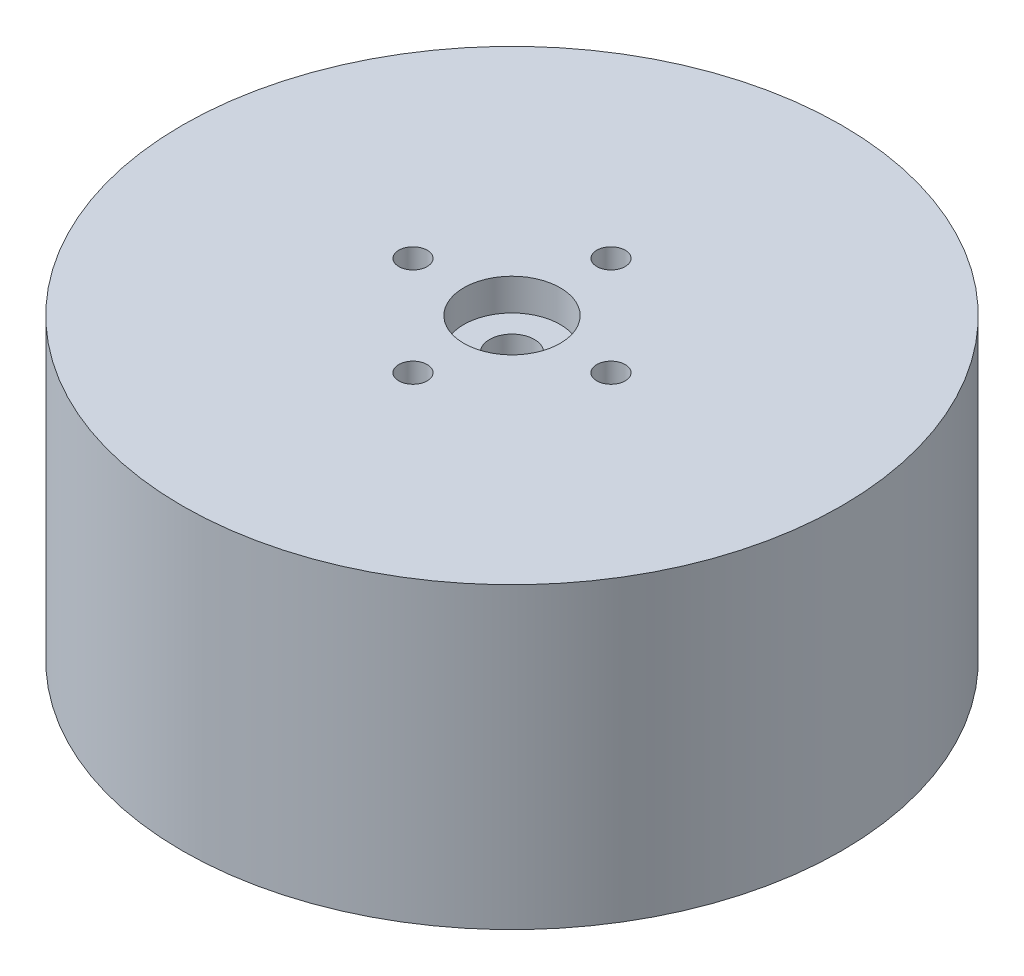
ISO-10303-21;
HEADER;
FILE_DESCRIPTION(('STEP AP214'),'2;1');
FILE_NAME('part.step','',(''),(''),'','','');
FILE_SCHEMA(('AUTOMOTIVE_DESIGN { 1 0 10303 214 1 1 1 1 }'));
ENDSEC;
DATA;
#1=APPLICATION_CONTEXT('core data for automotive mechanical design processes');
#2=APPLICATION_PROTOCOL_DEFINITION('international standard','automotive_design',2000,#1);
#3=PRODUCT_CONTEXT('',#1,'mechanical');
#4=PRODUCT('Part','Part','',(#3));
#5=PRODUCT_RELATED_PRODUCT_CATEGORY('part','',(#4));
#6=PRODUCT_DEFINITION_FORMATION('','',#4);
#7=PRODUCT_DEFINITION_CONTEXT('part definition',#1,'design');
#8=PRODUCT_DEFINITION('design','',#6,#7);
#9=PRODUCT_DEFINITION_SHAPE('','',#8);
#10=(LENGTH_UNIT() NAMED_UNIT(*) SI_UNIT(.MILLI.,.METRE.));
#11=(NAMED_UNIT(*) PLANE_ANGLE_UNIT() SI_UNIT($,.RADIAN.));
#12=(NAMED_UNIT(*) SI_UNIT($,.STERADIAN.) SOLID_ANGLE_UNIT());
#13=UNCERTAINTY_MEASURE_WITH_UNIT(LENGTH_MEASURE(1.E-05),#10,'distance_accuracy_value','');
#14=(GEOMETRIC_REPRESENTATION_CONTEXT(3) GLOBAL_UNCERTAINTY_ASSIGNED_CONTEXT((#13)) GLOBAL_UNIT_ASSIGNED_CONTEXT((#10,
#11,#12)) REPRESENTATION_CONTEXT('',''));
#15=CARTESIAN_POINT('',(0.,0.,0.));
#16=DIRECTION('',(0.,0.,1.));
#17=DIRECTION('',(1.,0.,0.));
#18=AXIS2_PLACEMENT_3D('',#15,#16,#17);
#19=CARTESIAN_POINT('',(0.,34.7,0.));
#20=DIRECTION('',(0.,-1.,0.));
#21=DIRECTION('',(0.,0.,-1.));
#22=AXIS2_PLACEMENT_3D('',#19,#20,#21);
#23=CYLINDRICAL_SURFACE('',#22,2.6);
#24=CARTESIAN_POINT('',(0.,3.7,0.));
#25=DIRECTION('',(0.,-1.,0.));
#26=DIRECTION('',(0.,0.,-1.));
#27=AXIS2_PLACEMENT_3D('',#24,#25,#26);
#28=CIRCLE('',#27,2.6);
#29=CARTESIAN_POINT('',(0.,3.7,-2.6));
#30=VERTEX_POINT('',#29);
#31=EDGE_CURVE('E44',#30,#30,#28,.F.);
#32=ORIENTED_EDGE('',*,*,#31,.F.);
#33=EDGE_LOOP('',(#32));
#34=FACE_BOUND('',#33,.T.);
#35=CARTESIAN_POINT('',(0.,31.,0.));
#36=DIRECTION('',(0.,1.,0.));
#37=DIRECTION('',(0.,0.,1.));
#38=AXIS2_PLACEMENT_3D('',#35,#36,#37);
#39=CIRCLE('',#38,2.6);
#40=CARTESIAN_POINT('',(0.,31.,2.6));
#41=VERTEX_POINT('',#40);
#42=EDGE_CURVE('E35',#41,#41,#39,.F.);
#43=ORIENTED_EDGE('',*,*,#42,.F.);
#44=EDGE_LOOP('',(#43));
#45=FACE_BOUND('',#44,.T.);
#46=ADVANCED_FACE('F31',(#34,#45),#23,.F.);
#47=CARTESIAN_POINT('',(0.,34.7,0.));
#48=DIRECTION('',(0.,-1.,0.));
#49=DIRECTION('',(0.,0.,-1.));
#50=AXIS2_PLACEMENT_3D('',#47,#48,#49);
#51=CYLINDRICAL_SURFACE('',#50,38.3);
#52=CARTESIAN_POINT('',(0.,34.7,0.));
#53=DIRECTION('',(0.,1.,0.));
#54=DIRECTION('',(0.,0.,1.));
#55=AXIS2_PLACEMENT_3D('',#52,#53,#54);
#56=CIRCLE('',#55,38.3);
#57=CARTESIAN_POINT('',(0.,34.7,38.3));
#58=VERTEX_POINT('',#57);
#59=EDGE_CURVE('E10',#58,#58,#56,.T.);
#60=ORIENTED_EDGE('',*,*,#59,.F.);
#61=EDGE_LOOP('',(#60));
#62=FACE_BOUND('',#61,.T.);
#63=CARTESIAN_POINT('',(0.,0.,0.));
#64=DIRECTION('',(0.,1.,0.));
#65=DIRECTION('',(0.,0.,1.));
#66=AXIS2_PLACEMENT_3D('',#63,#64,#65);
#67=CIRCLE('',#66,38.3);
#68=CARTESIAN_POINT('',(0.,0.,38.3));
#69=VERTEX_POINT('',#68);
#70=EDGE_CURVE('E39',#69,#69,#67,.T.);
#71=ORIENTED_EDGE('',*,*,#70,.T.);
#72=EDGE_LOOP('',(#71));
#73=FACE_BOUND('',#72,.T.);
#74=ADVANCED_FACE('F33',(#62,#73),#51,.T.);
#75=CARTESIAN_POINT('',(0.,34.7,0.));
#76=DIRECTION('',(0.,1.,0.));
#77=DIRECTION('',(0.,0.,1.));
#78=AXIS2_PLACEMENT_3D('',#75,#76,#77);
#79=PLANE('',#78);
#80=CARTESIAN_POINT('',(0.,34.7,-11.5));
#81=DIRECTION('',(0.,1.,0.));
#82=DIRECTION('',(0.,0.,1.));
#83=AXIS2_PLACEMENT_3D('',#80,#81,#82);
#84=CIRCLE('',#83,1.65);
#85=CARTESIAN_POINT('',(0.,34.7,-9.85));
#86=VERTEX_POINT('',#85);
#87=EDGE_CURVE('E83',#86,#86,#84,.T.);
#88=ORIENTED_EDGE('',*,*,#87,.F.);
#89=EDGE_LOOP('',(#88));
#90=FACE_BOUND('',#89,.T.);
#91=CARTESIAN_POINT('',(11.5,34.7,0.));
#92=DIRECTION('',(0.,1.,0.));
#93=DIRECTION('',(0.,0.,1.));
#94=AXIS2_PLACEMENT_3D('',#91,#92,#93);
#95=CIRCLE('',#94,1.65);
#96=CARTESIAN_POINT('',(11.5,34.7,1.65000000000004));
#97=VERTEX_POINT('',#96);
#98=EDGE_CURVE('E77',#97,#97,#95,.T.);
#99=ORIENTED_EDGE('',*,*,#98,.F.);
#100=EDGE_LOOP('',(#99));
#101=FACE_BOUND('',#100,.T.);
#102=CARTESIAN_POINT('',(0.,34.7,11.5));
#103=DIRECTION('',(0.,1.,0.));
#104=DIRECTION('',(0.,0.,1.));
#105=AXIS2_PLACEMENT_3D('',#102,#103,#104);
#106=CIRCLE('',#105,1.65);
#107=CARTESIAN_POINT('',(0.,34.7,13.15));
#108=VERTEX_POINT('',#107);
#109=EDGE_CURVE('E71',#108,#108,#106,.T.);
#110=ORIENTED_EDGE('',*,*,#109,.F.);
#111=EDGE_LOOP('',(#110));
#112=FACE_BOUND('',#111,.T.);
#113=CARTESIAN_POINT('',(-11.5,34.7,-1.20456106190088E-13));
#114=DIRECTION('',(0.,1.,0.));
#115=DIRECTION('',(0.,0.,1.));
#116=AXIS2_PLACEMENT_3D('',#113,#114,#115);
#117=CIRCLE('',#116,1.65);
#118=CARTESIAN_POINT('',(-11.5,34.7,1.64999999999988));
#119=VERTEX_POINT('',#118);
#120=EDGE_CURVE('E65',#119,#119,#117,.T.);
#121=ORIENTED_EDGE('',*,*,#120,.F.);
#122=EDGE_LOOP('',(#121));
#123=FACE_BOUND('',#122,.T.);
#124=CARTESIAN_POINT('',(0.,34.7,0.));
#125=DIRECTION('',(0.,1.,0.));
#126=DIRECTION('',(0.,0.,1.));
#127=AXIS2_PLACEMENT_3D('',#124,#125,#126);
#128=CIRCLE('',#127,5.6);
#129=CARTESIAN_POINT('',(0.,34.7,5.6));
#130=VERTEX_POINT('',#129);
#131=EDGE_CURVE('E58',#130,#130,#128,.T.);
#132=ORIENTED_EDGE('',*,*,#131,.F.);
#133=EDGE_LOOP('',(#132));
#134=FACE_BOUND('',#133,.T.);
#135=ORIENTED_EDGE('',*,*,#59,.T.);
#136=EDGE_LOOP('',(#135));
#137=FACE_BOUND('',#136,.T.);
#138=ADVANCED_FACE('F99',(#90,#101,#112,#123,#134,#137),#79,.T.);
#139=CARTESIAN_POINT('',(0.,0.,0.));
#140=DIRECTION('',(0.,1.,0.));
#141=DIRECTION('',(0.,0.,1.));
#142=AXIS2_PLACEMENT_3D('',#139,#140,#141);
#143=PLANE('',#142);
#144=CARTESIAN_POINT('',(0.,0.,-11.5));
#145=DIRECTION('',(0.,1.,0.));
#146=DIRECTION('',(0.,0.,1.));
#147=AXIS2_PLACEMENT_3D('',#144,#145,#146);
#148=CIRCLE('',#147,1.65);
#149=CARTESIAN_POINT('',(0.,0.,-9.85));
#150=VERTEX_POINT('',#149);
#151=EDGE_CURVE('E62',#150,#150,#148,.T.);
#152=ORIENTED_EDGE('',*,*,#151,.T.);
#153=EDGE_LOOP('',(#152));
#154=FACE_BOUND('',#153,.T.);
#155=CARTESIAN_POINT('',(11.5,0.,0.));
#156=DIRECTION('',(0.,1.,0.));
#157=DIRECTION('',(0.,0.,1.));
#158=AXIS2_PLACEMENT_3D('',#155,#156,#157);
#159=CIRCLE('',#158,1.65);
#160=CARTESIAN_POINT('',(11.5,0.,1.65000000000004));
#161=VERTEX_POINT('',#160);
#162=EDGE_CURVE('E80',#161,#161,#159,.T.);
#163=ORIENTED_EDGE('',*,*,#162,.T.);
#164=EDGE_LOOP('',(#163));
#165=FACE_BOUND('',#164,.T.);
#166=CARTESIAN_POINT('',(0.,0.,11.5));
#167=DIRECTION('',(0.,1.,0.));
#168=DIRECTION('',(0.,0.,1.));
#169=AXIS2_PLACEMENT_3D('',#166,#167,#168);
#170=CIRCLE('',#169,1.65);
#171=CARTESIAN_POINT('',(0.,0.,13.15));
#172=VERTEX_POINT('',#171);
#173=EDGE_CURVE('E74',#172,#172,#170,.T.);
#174=ORIENTED_EDGE('',*,*,#173,.T.);
#175=EDGE_LOOP('',(#174));
#176=FACE_BOUND('',#175,.T.);
#177=CARTESIAN_POINT('',(-11.5,0.,-1.20456106190088E-13));
#178=DIRECTION('',(0.,1.,0.));
#179=DIRECTION('',(0.,0.,1.));
#180=AXIS2_PLACEMENT_3D('',#177,#178,#179);
#181=CIRCLE('',#180,1.65);
#182=CARTESIAN_POINT('',(-11.5,0.,1.64999999999988));
#183=VERTEX_POINT('',#182);
#184=EDGE_CURVE('E68',#183,#183,#181,.T.);
#185=ORIENTED_EDGE('',*,*,#184,.T.);
#186=EDGE_LOOP('',(#185));
#187=FACE_BOUND('',#186,.T.);
#188=CARTESIAN_POINT('',(0.,0.,0.));
#189=DIRECTION('',(0.,-1.,0.));
#190=DIRECTION('',(0.,0.,-1.));
#191=AXIS2_PLACEMENT_3D('',#188,#189,#190);
#192=CIRCLE('',#191,5.6);
#193=CARTESIAN_POINT('',(0.,0.,-5.6));
#194=VERTEX_POINT('',#193);
#195=EDGE_CURVE('E47',#194,#194,#192,.T.);
#196=ORIENTED_EDGE('',*,*,#195,.F.);
#197=EDGE_LOOP('',(#196));
#198=FACE_BOUND('',#197,.T.);
#199=ORIENTED_EDGE('',*,*,#70,.F.);
#200=EDGE_LOOP('',(#199));
#201=FACE_BOUND('',#200,.T.);
#202=ADVANCED_FACE('F89',(#154,#165,#176,#187,#198,#201),#143,.F.);
#203=CARTESIAN_POINT('',(0.,3.7,0.));
#204=DIRECTION('',(0.,-1.,0.));
#205=DIRECTION('',(0.,0.,-1.));
#206=AXIS2_PLACEMENT_3D('',#203,#204,#205);
#207=PLANE('',#206);
#208=CARTESIAN_POINT('',(0.,3.7,0.));
#209=DIRECTION('',(0.,-1.,0.));
#210=DIRECTION('',(0.,0.,-1.));
#211=AXIS2_PLACEMENT_3D('',#208,#209,#210);
#212=CIRCLE('',#211,5.6);
#213=CARTESIAN_POINT('',(0.,3.7,-5.6));
#214=VERTEX_POINT('',#213);
#215=EDGE_CURVE('E50',#214,#214,#212,.T.);
#216=ORIENTED_EDGE('',*,*,#215,.T.);
#217=EDGE_LOOP('',(#216));
#218=FACE_BOUND('',#217,.T.);
#219=ORIENTED_EDGE('',*,*,#31,.T.);
#220=EDGE_LOOP('',(#219));
#221=FACE_BOUND('',#220,.T.);
#222=ADVANCED_FACE('F139',(#218,#221),#207,.T.);
#223=CARTESIAN_POINT('',(0.,3.7,0.));
#224=DIRECTION('',(0.,-1.,0.));
#225=DIRECTION('',(0.,0.,-1.));
#226=AXIS2_PLACEMENT_3D('',#223,#224,#225);
#227=CYLINDRICAL_SURFACE('',#226,5.6);
#228=ORIENTED_EDGE('',*,*,#215,.F.);
#229=EDGE_LOOP('',(#228));
#230=FACE_BOUND('',#229,.T.);
#231=ORIENTED_EDGE('',*,*,#195,.T.);
#232=EDGE_LOOP('',(#231));
#233=FACE_BOUND('',#232,.T.);
#234=ADVANCED_FACE('F124',(#230,#233),#227,.F.);
#235=CARTESIAN_POINT('',(0.,31.,0.));
#236=DIRECTION('',(0.,1.,0.));
#237=DIRECTION('',(0.,0.,1.));
#238=AXIS2_PLACEMENT_3D('',#235,#236,#237);
#239=PLANE('',#238);
#240=CARTESIAN_POINT('',(0.,31.,0.));
#241=DIRECTION('',(0.,1.,0.));
#242=DIRECTION('',(0.,0.,1.));
#243=AXIS2_PLACEMENT_3D('',#240,#241,#242);
#244=CIRCLE('',#243,5.6);
#245=CARTESIAN_POINT('',(0.,31.,5.6));
#246=VERTEX_POINT('',#245);
#247=EDGE_CURVE('E61',#246,#246,#244,.T.);
#248=ORIENTED_EDGE('',*,*,#247,.T.);
#249=EDGE_LOOP('',(#248));
#250=FACE_BOUND('',#249,.T.);
#251=ORIENTED_EDGE('',*,*,#42,.T.);
#252=EDGE_LOOP('',(#251));
#253=FACE_BOUND('',#252,.T.);
#254=ADVANCED_FACE('F114',(#250,#253),#239,.T.);
#255=CARTESIAN_POINT('',(0.,31.,0.));
#256=DIRECTION('',(0.,1.,0.));
#257=DIRECTION('',(0.,0.,1.));
#258=AXIS2_PLACEMENT_3D('',#255,#256,#257);
#259=CYLINDRICAL_SURFACE('',#258,5.6);
#260=ORIENTED_EDGE('',*,*,#247,.F.);
#261=EDGE_LOOP('',(#260));
#262=FACE_BOUND('',#261,.T.);
#263=ORIENTED_EDGE('',*,*,#131,.T.);
#264=EDGE_LOOP('',(#263));
#265=FACE_BOUND('',#264,.T.);
#266=ADVANCED_FACE('F111',(#262,#265),#259,.F.);
#267=CARTESIAN_POINT('',(-11.5,0.,-1.20456106190088E-13));
#268=DIRECTION('',(0.,1.,0.));
#269=DIRECTION('',(0.,0.,1.));
#270=AXIS2_PLACEMENT_3D('',#267,#268,#269);
#271=CYLINDRICAL_SURFACE('',#270,1.65);
#272=ORIENTED_EDGE('',*,*,#184,.F.);
#273=EDGE_LOOP('',(#272));
#274=FACE_BOUND('',#273,.T.);
#275=ORIENTED_EDGE('',*,*,#120,.T.);
#276=EDGE_LOOP('',(#275));
#277=FACE_BOUND('',#276,.T.);
#278=ADVANCED_FACE('F113',(#274,#277),#271,.F.);
#279=CARTESIAN_POINT('',(0.,0.,11.5));
#280=DIRECTION('',(0.,1.,0.));
#281=DIRECTION('',(0.,0.,1.));
#282=AXIS2_PLACEMENT_3D('',#279,#280,#281);
#283=CYLINDRICAL_SURFACE('',#282,1.65);
#284=ORIENTED_EDGE('',*,*,#173,.F.);
#285=EDGE_LOOP('',(#284));
#286=FACE_BOUND('',#285,.T.);
#287=ORIENTED_EDGE('',*,*,#109,.T.);
#288=EDGE_LOOP('',(#287));
#289=FACE_BOUND('',#288,.T.);
#290=ADVANCED_FACE('F121',(#286,#289),#283,.F.);
#291=CARTESIAN_POINT('',(11.5,0.,0.));
#292=DIRECTION('',(0.,1.,0.));
#293=DIRECTION('',(0.,0.,1.));
#294=AXIS2_PLACEMENT_3D('',#291,#292,#293);
#295=CYLINDRICAL_SURFACE('',#294,1.65);
#296=ORIENTED_EDGE('',*,*,#162,.F.);
#297=EDGE_LOOP('',(#296));
#298=FACE_BOUND('',#297,.T.);
#299=ORIENTED_EDGE('',*,*,#98,.T.);
#300=EDGE_LOOP('',(#299));
#301=FACE_BOUND('',#300,.T.);
#302=ADVANCED_FACE('F95',(#298,#301),#295,.F.);
#303=CARTESIAN_POINT('',(0.,0.,-11.5));
#304=DIRECTION('',(0.,1.,0.));
#305=DIRECTION('',(0.,0.,1.));
#306=AXIS2_PLACEMENT_3D('',#303,#304,#305);
#307=CYLINDRICAL_SURFACE('',#306,1.65);
#308=ORIENTED_EDGE('',*,*,#151,.F.);
#309=EDGE_LOOP('',(#308));
#310=FACE_BOUND('',#309,.T.);
#311=ORIENTED_EDGE('',*,*,#87,.T.);
#312=EDGE_LOOP('',(#311));
#313=FACE_BOUND('',#312,.T.);
#314=ADVANCED_FACE('F92',(#310,#313),#307,.F.);
#315=CLOSED_SHELL('',(#46,#74,#138,#202,#222,#234,#254,#266,#278,#290,#302,#314));
#316=MANIFOLD_SOLID_BREP('B2',#315);
#317=ADVANCED_BREP_SHAPE_REPRESENTATION('',(#18,#316),#14);
#318=SHAPE_DEFINITION_REPRESENTATION(#9,#317);
ENDSEC;
END-ISO-10303-21;
